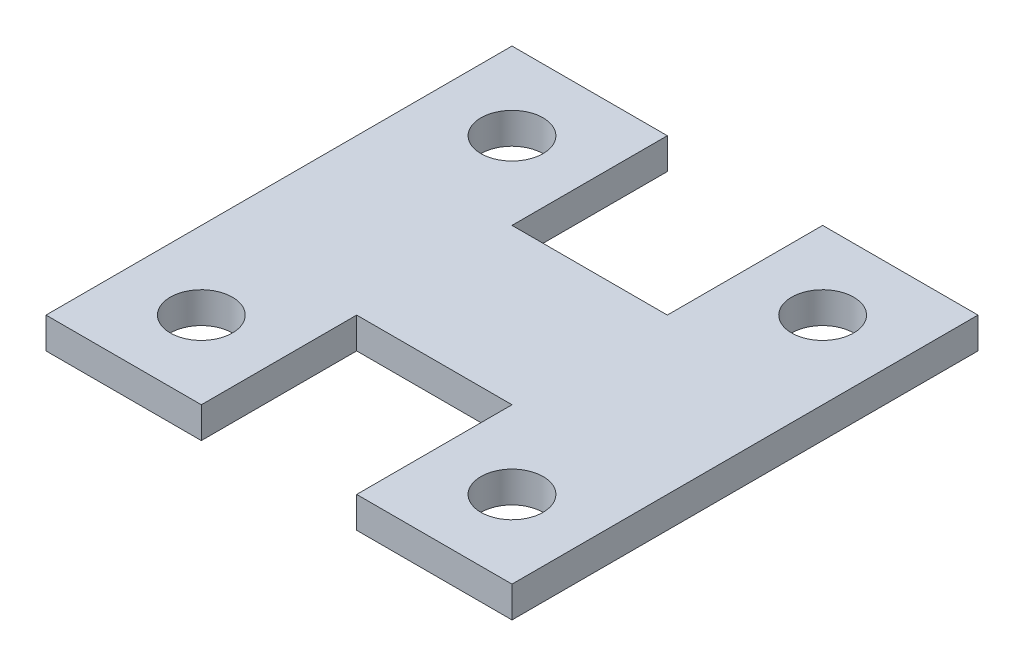
ISO-10303-21;
HEADER;
FILE_DESCRIPTION(('STEP AP214'),'2;1');
FILE_NAME('part.step','',(''),(''),'','','');
FILE_SCHEMA(('AUTOMOTIVE_DESIGN { 1 0 10303 214 1 1 1 1 }'));
ENDSEC;
DATA;
#1=APPLICATION_CONTEXT('core data for automotive mechanical design processes');
#2=APPLICATION_PROTOCOL_DEFINITION('international standard','automotive_design',2000,#1);
#3=PRODUCT_CONTEXT('',#1,'mechanical');
#4=PRODUCT('Part','Part','',(#3));
#5=PRODUCT_RELATED_PRODUCT_CATEGORY('part','',(#4));
#6=PRODUCT_DEFINITION_FORMATION('','',#4);
#7=PRODUCT_DEFINITION_CONTEXT('part definition',#1,'design');
#8=PRODUCT_DEFINITION('design','',#6,#7);
#9=PRODUCT_DEFINITION_SHAPE('','',#8);
#10=(LENGTH_UNIT() NAMED_UNIT(*) SI_UNIT(.MILLI.,.METRE.));
#11=(NAMED_UNIT(*) PLANE_ANGLE_UNIT() SI_UNIT($,.RADIAN.));
#12=(NAMED_UNIT(*) SI_UNIT($,.STERADIAN.) SOLID_ANGLE_UNIT());
#13=UNCERTAINTY_MEASURE_WITH_UNIT(LENGTH_MEASURE(1.E-05),#10,'distance_accuracy_value','');
#14=(GEOMETRIC_REPRESENTATION_CONTEXT(3) GLOBAL_UNCERTAINTY_ASSIGNED_CONTEXT((#13)) GLOBAL_UNIT_ASSIGNED_CONTEXT((#10,
#11,#12)) REPRESENTATION_CONTEXT('',''));
#15=CARTESIAN_POINT('',(0.,0.,0.));
#16=DIRECTION('',(0.,0.,1.));
#17=DIRECTION('',(1.,0.,0.));
#18=AXIS2_PLACEMENT_3D('',#15,#16,#17);
#19=CARTESIAN_POINT('',(0.,10.,0.));
#20=DIRECTION('',(0.,-1.,0.));
#21=DIRECTION('',(0.,0.,-1.));
#22=AXIS2_PLACEMENT_3D('',#19,#20,#21);
#23=PLANE('',#22);
#24=DIRECTION('',(1.,0.,0.));
#25=VECTOR('',#24,1.);
#26=CARTESIAN_POINT('',(25.,10.,75.));
#27=LINE('',#26,#25);
#28=CARTESIAN_POINT('',(25.,10.,75.));
#29=VERTEX_POINT('',#28);
#30=CARTESIAN_POINT('',(75.,10.,75.));
#31=VERTEX_POINT('',#30);
#32=EDGE_CURVE('E176',#29,#31,#27,.T.);
#33=ORIENTED_EDGE('',*,*,#32,.T.);
#34=DIRECTION('',(0.,0.,-1.));
#35=VECTOR('',#34,1.);
#36=CARTESIAN_POINT('',(75.,10.,-75.));
#37=LINE('',#36,#35);
#38=CARTESIAN_POINT('',(75.,10.,-75.));
#39=VERTEX_POINT('',#38);
#40=EDGE_CURVE('E104',#31,#39,#37,.T.);
#41=ORIENTED_EDGE('',*,*,#40,.T.);
#42=DIRECTION('',(-1.,0.,0.));
#43=VECTOR('',#42,1.);
#44=CARTESIAN_POINT('',(25.,10.,-75.));
#45=LINE('',#44,#43);
#46=CARTESIAN_POINT('',(25.,10.,-75.));
#47=VERTEX_POINT('',#46);
#48=EDGE_CURVE('E203',#39,#47,#45,.T.);
#49=ORIENTED_EDGE('',*,*,#48,.T.);
#50=DIRECTION('',(0.,0.,1.));
#51=VECTOR('',#50,1.);
#52=CARTESIAN_POINT('',(25.,10.,-75.));
#53=LINE('',#52,#51);
#54=CARTESIAN_POINT('',(25.,10.,-25.));
#55=VERTEX_POINT('',#54);
#56=EDGE_CURVE('E222',#47,#55,#53,.T.);
#57=ORIENTED_EDGE('',*,*,#56,.T.);
#58=DIRECTION('',(-1.,0.,0.));
#59=VECTOR('',#58,1.);
#60=CARTESIAN_POINT('',(-25.,10.,-25.));
#61=LINE('',#60,#59);
#62=CARTESIAN_POINT('',(-25.,10.,-25.));
#63=VERTEX_POINT('',#62);
#64=EDGE_CURVE('E219',#55,#63,#61,.T.);
#65=ORIENTED_EDGE('',*,*,#64,.T.);
#66=DIRECTION('',(0.,0.,-1.));
#67=VECTOR('',#66,1.);
#68=CARTESIAN_POINT('',(-25.,10.,-75.));
#69=LINE('',#68,#67);
#70=CARTESIAN_POINT('',(-25.,10.,-75.));
#71=VERTEX_POINT('',#70);
#72=EDGE_CURVE('E221',#63,#71,#69,.T.);
#73=ORIENTED_EDGE('',*,*,#72,.T.);
#74=DIRECTION('',(-1.,0.,0.));
#75=VECTOR('',#74,1.);
#76=CARTESIAN_POINT('',(-75.,10.,-75.));
#77=LINE('',#76,#75);
#78=CARTESIAN_POINT('',(-75.,10.,-75.));
#79=VERTEX_POINT('',#78);
#80=EDGE_CURVE('E224',#71,#79,#77,.T.);
#81=ORIENTED_EDGE('',*,*,#80,.T.);
#82=DIRECTION('',(0.,0.,1.));
#83=VECTOR('',#82,1.);
#84=CARTESIAN_POINT('',(-75.,10.,-75.));
#85=LINE('',#84,#83);
#86=CARTESIAN_POINT('',(-75.,10.,75.));
#87=VERTEX_POINT('',#86);
#88=EDGE_CURVE('E230',#79,#87,#85,.T.);
#89=ORIENTED_EDGE('',*,*,#88,.T.);
#90=DIRECTION('',(1.,0.,0.));
#91=VECTOR('',#90,1.);
#92=CARTESIAN_POINT('',(-75.,10.,75.));
#93=LINE('',#92,#91);
#94=CARTESIAN_POINT('',(-25.,10.,75.));
#95=VERTEX_POINT('',#94);
#96=EDGE_CURVE('E135',#87,#95,#93,.T.);
#97=ORIENTED_EDGE('',*,*,#96,.T.);
#98=DIRECTION('',(0.,0.,-1.));
#99=VECTOR('',#98,1.);
#100=CARTESIAN_POINT('',(-25.,10.,75.));
#101=LINE('',#100,#99);
#102=CARTESIAN_POINT('',(-25.,10.,25.));
#103=VERTEX_POINT('',#102);
#104=EDGE_CURVE('E129',#95,#103,#101,.T.);
#105=ORIENTED_EDGE('',*,*,#104,.T.);
#106=DIRECTION('',(1.,0.,0.));
#107=VECTOR('',#106,1.);
#108=CARTESIAN_POINT('',(-25.,10.,25.));
#109=LINE('',#108,#107);
#110=CARTESIAN_POINT('',(25.,10.,25.));
#111=VERTEX_POINT('',#110);
#112=EDGE_CURVE('E133',#103,#111,#109,.T.);
#113=ORIENTED_EDGE('',*,*,#112,.T.);
#114=DIRECTION('',(0.,0.,1.));
#115=VECTOR('',#114,1.);
#116=CARTESIAN_POINT('',(25.,10.,75.));
#117=LINE('',#116,#115);
#118=EDGE_CURVE('E49',#111,#29,#117,.T.);
#119=ORIENTED_EDGE('',*,*,#118,.T.);
#120=EDGE_LOOP('',(#33,#41,#49,#57,#65,#73,#81,#89,#97,#105,#113,#119));
#121=FACE_BOUND('',#120,.T.);
#122=CARTESIAN_POINT('',(-50.,10.,-50.));
#123=DIRECTION('',(0.,1.,0.));
#124=DIRECTION('',(0.,0.,1.));
#125=AXIS2_PLACEMENT_3D('',#122,#123,#124);
#126=CIRCLE('',#125,10.);
#127=CARTESIAN_POINT('',(-50.,10.,-40.));
#128=VERTEX_POINT('',#127);
#129=EDGE_CURVE('E157',#128,#128,#126,.T.);
#130=ORIENTED_EDGE('',*,*,#129,.F.);
#131=EDGE_LOOP('',(#130));
#132=FACE_BOUND('',#131,.T.);
#133=CARTESIAN_POINT('',(50.,10.,-50.));
#134=DIRECTION('',(0.,1.,0.));
#135=DIRECTION('',(0.,0.,-1.));
#136=AXIS2_PLACEMENT_3D('',#133,#134,#135);
#137=CIRCLE('',#136,10.);
#138=CARTESIAN_POINT('',(50.,10.,-60.));
#139=VERTEX_POINT('',#138);
#140=EDGE_CURVE('E294',#139,#139,#137,.T.);
#141=ORIENTED_EDGE('',*,*,#140,.F.);
#142=EDGE_LOOP('',(#141));
#143=FACE_BOUND('',#142,.T.);
#144=CARTESIAN_POINT('',(50.,10.,50.));
#145=DIRECTION('',(0.,1.,0.));
#146=DIRECTION('',(0.,0.,1.));
#147=AXIS2_PLACEMENT_3D('',#144,#145,#146);
#148=CIRCLE('',#147,10.);
#149=CARTESIAN_POINT('',(50.,10.,60.));
#150=VERTEX_POINT('',#149);
#151=EDGE_CURVE('E288',#150,#150,#148,.T.);
#152=ORIENTED_EDGE('',*,*,#151,.F.);
#153=EDGE_LOOP('',(#152));
#154=FACE_BOUND('',#153,.T.);
#155=CARTESIAN_POINT('',(-50.,10.,50.));
#156=DIRECTION('',(0.,1.,0.));
#157=DIRECTION('',(0.,0.,-1.));
#158=AXIS2_PLACEMENT_3D('',#155,#156,#157);
#159=CIRCLE('',#158,10.);
#160=CARTESIAN_POINT('',(-50.,10.,40.));
#161=VERTEX_POINT('',#160);
#162=EDGE_CURVE('E279',#161,#161,#159,.T.);
#163=ORIENTED_EDGE('',*,*,#162,.F.);
#164=EDGE_LOOP('',(#163));
#165=FACE_BOUND('',#164,.T.);
#166=ADVANCED_FACE('F32',(#121,#132,#143,#154,#165),#23,.F.);
#167=CARTESIAN_POINT('',(0.,0.,0.));
#168=DIRECTION('',(0.,-1.,0.));
#169=DIRECTION('',(0.,0.,-1.));
#170=AXIS2_PLACEMENT_3D('',#167,#168,#169);
#171=PLANE('',#170);
#172=CARTESIAN_POINT('',(50.,0.,50.));
#173=DIRECTION('',(0.,1.,0.));
#174=DIRECTION('',(0.,0.,1.));
#175=AXIS2_PLACEMENT_3D('',#172,#173,#174);
#176=CIRCLE('',#175,10.);
#177=CARTESIAN_POINT('',(50.,0.,60.));
#178=VERTEX_POINT('',#177);
#179=EDGE_CURVE('E285',#178,#178,#176,.T.);
#180=ORIENTED_EDGE('',*,*,#179,.T.);
#181=EDGE_LOOP('',(#180));
#182=FACE_BOUND('',#181,.T.);
#183=CARTESIAN_POINT('',(-50.,0.,-50.));
#184=DIRECTION('',(0.,1.,0.));
#185=DIRECTION('',(0.,0.,1.));
#186=AXIS2_PLACEMENT_3D('',#183,#184,#185);
#187=CIRCLE('',#186,10.);
#188=CARTESIAN_POINT('',(-50.,0.,-40.));
#189=VERTEX_POINT('',#188);
#190=EDGE_CURVE('E297',#189,#189,#187,.T.);
#191=ORIENTED_EDGE('',*,*,#190,.T.);
#192=EDGE_LOOP('',(#191));
#193=FACE_BOUND('',#192,.T.);
#194=DIRECTION('',(1.,0.,0.));
#195=VECTOR('',#194,1.);
#196=CARTESIAN_POINT('',(25.,0.,75.));
#197=LINE('',#196,#195);
#198=CARTESIAN_POINT('',(25.,0.,75.));
#199=VERTEX_POINT('',#198);
#200=CARTESIAN_POINT('',(75.,0.,75.));
#201=VERTEX_POINT('',#200);
#202=EDGE_CURVE('E153',#199,#201,#197,.T.);
#203=ORIENTED_EDGE('',*,*,#202,.F.);
#204=DIRECTION('',(0.,0.,1.));
#205=VECTOR('',#204,1.);
#206=CARTESIAN_POINT('',(25.,0.,75.));
#207=LINE('',#206,#205);
#208=CARTESIAN_POINT('',(25.,0.,25.));
#209=VERTEX_POINT('',#208);
#210=EDGE_CURVE('E96',#209,#199,#207,.T.);
#211=ORIENTED_EDGE('',*,*,#210,.F.);
#212=DIRECTION('',(1.,0.,0.));
#213=VECTOR('',#212,1.);
#214=CARTESIAN_POINT('',(-25.,0.,25.));
#215=LINE('',#214,#213);
#216=CARTESIAN_POINT('',(-25.,0.,25.));
#217=VERTEX_POINT('',#216);
#218=EDGE_CURVE('E90',#217,#209,#215,.T.);
#219=ORIENTED_EDGE('',*,*,#218,.F.);
#220=DIRECTION('',(0.,0.,-1.));
#221=VECTOR('',#220,1.);
#222=CARTESIAN_POINT('',(-25.,0.,75.));
#223=LINE('',#222,#221);
#224=CARTESIAN_POINT('',(-25.,0.,75.));
#225=VERTEX_POINT('',#224);
#226=EDGE_CURVE('E143',#225,#217,#223,.T.);
#227=ORIENTED_EDGE('',*,*,#226,.F.);
#228=DIRECTION('',(1.,0.,0.));
#229=VECTOR('',#228,1.);
#230=CARTESIAN_POINT('',(-75.,0.,75.));
#231=LINE('',#230,#229);
#232=CARTESIAN_POINT('',(-75.,0.,75.));
#233=VERTEX_POINT('',#232);
#234=EDGE_CURVE('E171',#233,#225,#231,.T.);
#235=ORIENTED_EDGE('',*,*,#234,.F.);
#236=DIRECTION('',(0.,0.,1.));
#237=VECTOR('',#236,1.);
#238=CARTESIAN_POINT('',(-75.,0.,-75.));
#239=LINE('',#238,#237);
#240=CARTESIAN_POINT('',(-75.,0.,-75.));
#241=VERTEX_POINT('',#240);
#242=EDGE_CURVE('E169',#241,#233,#239,.T.);
#243=ORIENTED_EDGE('',*,*,#242,.F.);
#244=DIRECTION('',(-1.,0.,0.));
#245=VECTOR('',#244,1.);
#246=CARTESIAN_POINT('',(-75.,0.,-75.));
#247=LINE('',#246,#245);
#248=CARTESIAN_POINT('',(-25.,0.,-75.));
#249=VERTEX_POINT('',#248);
#250=EDGE_CURVE('E167',#249,#241,#247,.T.);
#251=ORIENTED_EDGE('',*,*,#250,.F.);
#252=DIRECTION('',(0.,0.,-1.));
#253=VECTOR('',#252,1.);
#254=CARTESIAN_POINT('',(-25.,0.,-75.));
#255=LINE('',#254,#253);
#256=CARTESIAN_POINT('',(-25.,0.,-25.));
#257=VERTEX_POINT('',#256);
#258=EDGE_CURVE('E165',#257,#249,#255,.T.);
#259=ORIENTED_EDGE('',*,*,#258,.F.);
#260=DIRECTION('',(-1.,0.,0.));
#261=VECTOR('',#260,1.);
#262=CARTESIAN_POINT('',(-25.,0.,-25.));
#263=LINE('',#262,#261);
#264=CARTESIAN_POINT('',(25.,0.,-25.));
#265=VERTEX_POINT('',#264);
#266=EDGE_CURVE('E163',#265,#257,#263,.T.);
#267=ORIENTED_EDGE('',*,*,#266,.F.);
#268=DIRECTION('',(0.,0.,1.));
#269=VECTOR('',#268,1.);
#270=CARTESIAN_POINT('',(25.,0.,-75.));
#271=LINE('',#270,#269);
#272=CARTESIAN_POINT('',(25.,0.,-75.));
#273=VERTEX_POINT('',#272);
#274=EDGE_CURVE('E161',#273,#265,#271,.T.);
#275=ORIENTED_EDGE('',*,*,#274,.F.);
#276=DIRECTION('',(-1.,0.,0.));
#277=VECTOR('',#276,1.);
#278=CARTESIAN_POINT('',(25.,0.,-75.));
#279=LINE('',#278,#277);
#280=CARTESIAN_POINT('',(75.,0.,-75.));
#281=VERTEX_POINT('',#280);
#282=EDGE_CURVE('E159',#281,#273,#279,.T.);
#283=ORIENTED_EDGE('',*,*,#282,.F.);
#284=DIRECTION('',(0.,0.,-1.));
#285=VECTOR('',#284,1.);
#286=CARTESIAN_POINT('',(75.,0.,-75.));
#287=LINE('',#286,#285);
#288=EDGE_CURVE('E156',#201,#281,#287,.T.);
#289=ORIENTED_EDGE('',*,*,#288,.F.);
#290=EDGE_LOOP('',(#203,#211,#219,#227,#235,#243,#251,#259,#267,#275,#283,#289));
#291=FACE_BOUND('',#290,.T.);
#292=CARTESIAN_POINT('',(50.,0.,-50.));
#293=DIRECTION('',(0.,1.,0.));
#294=DIRECTION('',(0.,0.,-1.));
#295=AXIS2_PLACEMENT_3D('',#292,#293,#294);
#296=CIRCLE('',#295,10.);
#297=CARTESIAN_POINT('',(50.,0.,-60.));
#298=VERTEX_POINT('',#297);
#299=EDGE_CURVE('E291',#298,#298,#296,.T.);
#300=ORIENTED_EDGE('',*,*,#299,.T.);
#301=EDGE_LOOP('',(#300));
#302=FACE_BOUND('',#301,.T.);
#303=CARTESIAN_POINT('',(-50.,0.,50.));
#304=DIRECTION('',(0.,1.,0.));
#305=DIRECTION('',(0.,0.,-1.));
#306=AXIS2_PLACEMENT_3D('',#303,#304,#305);
#307=CIRCLE('',#306,10.);
#308=CARTESIAN_POINT('',(-50.,0.,40.));
#309=VERTEX_POINT('',#308);
#310=EDGE_CURVE('E282',#309,#309,#307,.T.);
#311=ORIENTED_EDGE('',*,*,#310,.T.);
#312=EDGE_LOOP('',(#311));
#313=FACE_BOUND('',#312,.T.);
#314=ADVANCED_FACE('F207',(#182,#193,#291,#302,#313),#171,.T.);
#315=CARTESIAN_POINT('',(25.,10.,75.));
#316=DIRECTION('',(0.,0.,-1.));
#317=DIRECTION('',(-1.,0.,0.));
#318=AXIS2_PLACEMENT_3D('',#315,#316,#317);
#319=PLANE('',#318);
#320=ORIENTED_EDGE('',*,*,#202,.T.);
#321=DIRECTION('',(0.,-1.,0.));
#322=VECTOR('',#321,1.);
#323=CARTESIAN_POINT('',(75.,10.,75.));
#324=LINE('',#323,#322);
#325=EDGE_CURVE('E11',#31,#201,#324,.T.);
#326=ORIENTED_EDGE('',*,*,#325,.F.);
#327=ORIENTED_EDGE('',*,*,#32,.F.);
#328=DIRECTION('',(0.,-1.,0.));
#329=VECTOR('',#328,1.);
#330=CARTESIAN_POINT('',(25.,10.,75.));
#331=LINE('',#330,#329);
#332=EDGE_CURVE('E149',#29,#199,#331,.T.);
#333=ORIENTED_EDGE('',*,*,#332,.T.);
#334=EDGE_LOOP('',(#320,#326,#327,#333));
#335=FACE_BOUND('',#334,.T.);
#336=ADVANCED_FACE('F34',(#335),#319,.F.);
#337=CARTESIAN_POINT('',(75.,10.,-75.));
#338=DIRECTION('',(-1.,0.,0.));
#339=DIRECTION('',(0.,0.,1.));
#340=AXIS2_PLACEMENT_3D('',#337,#338,#339);
#341=PLANE('',#340);
#342=ORIENTED_EDGE('',*,*,#288,.T.);
#343=DIRECTION('',(0.,-1.,0.));
#344=VECTOR('',#343,1.);
#345=CARTESIAN_POINT('',(75.,10.,-75.));
#346=LINE('',#345,#344);
#347=EDGE_CURVE('E41',#39,#281,#346,.T.);
#348=ORIENTED_EDGE('',*,*,#347,.F.);
#349=ORIENTED_EDGE('',*,*,#40,.F.);
#350=ORIENTED_EDGE('',*,*,#325,.T.);
#351=EDGE_LOOP('',(#342,#348,#349,#350));
#352=FACE_BOUND('',#351,.T.);
#353=ADVANCED_FACE('F409',(#352),#341,.F.);
#354=CARTESIAN_POINT('',(25.,10.,-75.));
#355=DIRECTION('',(0.,0.,1.));
#356=DIRECTION('',(1.,0.,0.));
#357=AXIS2_PLACEMENT_3D('',#354,#355,#356);
#358=PLANE('',#357);
#359=ORIENTED_EDGE('',*,*,#282,.T.);
#360=DIRECTION('',(0.,-1.,0.));
#361=VECTOR('',#360,1.);
#362=CARTESIAN_POINT('',(25.,10.,-75.));
#363=LINE('',#362,#361);
#364=EDGE_CURVE('E195',#47,#273,#363,.T.);
#365=ORIENTED_EDGE('',*,*,#364,.F.);
#366=ORIENTED_EDGE('',*,*,#48,.F.);
#367=ORIENTED_EDGE('',*,*,#347,.T.);
#368=EDGE_LOOP('',(#359,#365,#366,#367));
#369=FACE_BOUND('',#368,.T.);
#370=ADVANCED_FACE('F201',(#369),#358,.F.);
#371=CARTESIAN_POINT('',(25.,10.,-75.));
#372=DIRECTION('',(1.,0.,0.));
#373=DIRECTION('',(0.,0.,-1.));
#374=AXIS2_PLACEMENT_3D('',#371,#372,#373);
#375=PLANE('',#374);
#376=ORIENTED_EDGE('',*,*,#274,.T.);
#377=DIRECTION('',(0.,-1.,0.));
#378=VECTOR('',#377,1.);
#379=CARTESIAN_POINT('',(25.,10.,-25.));
#380=LINE('',#379,#378);
#381=EDGE_CURVE('E192',#55,#265,#380,.T.);
#382=ORIENTED_EDGE('',*,*,#381,.F.);
#383=ORIENTED_EDGE('',*,*,#56,.F.);
#384=ORIENTED_EDGE('',*,*,#364,.T.);
#385=EDGE_LOOP('',(#376,#382,#383,#384));
#386=FACE_BOUND('',#385,.T.);
#387=ADVANCED_FACE('F213',(#386),#375,.F.);
#388=CARTESIAN_POINT('',(-25.,10.,-25.));
#389=DIRECTION('',(0.,0.,1.));
#390=DIRECTION('',(1.,0.,0.));
#391=AXIS2_PLACEMENT_3D('',#388,#389,#390);
#392=PLANE('',#391);
#393=ORIENTED_EDGE('',*,*,#266,.T.);
#394=DIRECTION('',(0.,-1.,0.));
#395=VECTOR('',#394,1.);
#396=CARTESIAN_POINT('',(-25.,10.,-25.));
#397=LINE('',#396,#395);
#398=EDGE_CURVE('E189',#63,#257,#397,.T.);
#399=ORIENTED_EDGE('',*,*,#398,.F.);
#400=ORIENTED_EDGE('',*,*,#64,.F.);
#401=ORIENTED_EDGE('',*,*,#381,.T.);
#402=EDGE_LOOP('',(#393,#399,#400,#401));
#403=FACE_BOUND('',#402,.T.);
#404=ADVANCED_FACE('F217',(#403),#392,.F.);
#405=CARTESIAN_POINT('',(-25.,10.,-75.));
#406=DIRECTION('',(-1.,0.,0.));
#407=DIRECTION('',(0.,0.,1.));
#408=AXIS2_PLACEMENT_3D('',#405,#406,#407);
#409=PLANE('',#408);
#410=ORIENTED_EDGE('',*,*,#258,.T.);
#411=DIRECTION('',(0.,-1.,0.));
#412=VECTOR('',#411,1.);
#413=CARTESIAN_POINT('',(-25.,10.,-75.));
#414=LINE('',#413,#412);
#415=EDGE_CURVE('E186',#71,#249,#414,.T.);
#416=ORIENTED_EDGE('',*,*,#415,.F.);
#417=ORIENTED_EDGE('',*,*,#72,.F.);
#418=ORIENTED_EDGE('',*,*,#398,.T.);
#419=EDGE_LOOP('',(#410,#416,#417,#418));
#420=FACE_BOUND('',#419,.T.);
#421=ADVANCED_FACE('F374',(#420),#409,.F.);
#422=CARTESIAN_POINT('',(-75.,10.,-75.));
#423=DIRECTION('',(0.,0.,1.));
#424=DIRECTION('',(1.,0.,0.));
#425=AXIS2_PLACEMENT_3D('',#422,#423,#424);
#426=PLANE('',#425);
#427=ORIENTED_EDGE('',*,*,#250,.T.);
#428=DIRECTION('',(0.,-1.,0.));
#429=VECTOR('',#428,1.);
#430=CARTESIAN_POINT('',(-75.,10.,-75.));
#431=LINE('',#430,#429);
#432=EDGE_CURVE('E183',#79,#241,#431,.T.);
#433=ORIENTED_EDGE('',*,*,#432,.F.);
#434=ORIENTED_EDGE('',*,*,#80,.F.);
#435=ORIENTED_EDGE('',*,*,#415,.T.);
#436=EDGE_LOOP('',(#427,#433,#434,#435));
#437=FACE_BOUND('',#436,.T.);
#438=ADVANCED_FACE('F365',(#437),#426,.F.);
#439=CARTESIAN_POINT('',(-75.,10.,-75.));
#440=DIRECTION('',(1.,0.,0.));
#441=DIRECTION('',(0.,0.,-1.));
#442=AXIS2_PLACEMENT_3D('',#439,#440,#441);
#443=PLANE('',#442);
#444=ORIENTED_EDGE('',*,*,#242,.T.);
#445=DIRECTION('',(0.,-1.,0.));
#446=VECTOR('',#445,1.);
#447=CARTESIAN_POINT('',(-75.,10.,75.));
#448=LINE('',#447,#446);
#449=EDGE_CURVE('E180',#87,#233,#448,.T.);
#450=ORIENTED_EDGE('',*,*,#449,.F.);
#451=ORIENTED_EDGE('',*,*,#88,.F.);
#452=ORIENTED_EDGE('',*,*,#432,.T.);
#453=EDGE_LOOP('',(#444,#450,#451,#452));
#454=FACE_BOUND('',#453,.T.);
#455=ADVANCED_FACE('F236',(#454),#443,.F.);
#456=CARTESIAN_POINT('',(-75.,10.,75.));
#457=DIRECTION('',(0.,0.,-1.));
#458=DIRECTION('',(-1.,0.,0.));
#459=AXIS2_PLACEMENT_3D('',#456,#457,#458);
#460=PLANE('',#459);
#461=ORIENTED_EDGE('',*,*,#234,.T.);
#462=DIRECTION('',(0.,-1.,0.));
#463=VECTOR('',#462,1.);
#464=CARTESIAN_POINT('',(-25.,10.,75.));
#465=LINE('',#464,#463);
#466=EDGE_CURVE('E144',#95,#225,#465,.T.);
#467=ORIENTED_EDGE('',*,*,#466,.F.);
#468=ORIENTED_EDGE('',*,*,#96,.F.);
#469=ORIENTED_EDGE('',*,*,#449,.T.);
#470=EDGE_LOOP('',(#461,#467,#468,#469));
#471=FACE_BOUND('',#470,.T.);
#472=ADVANCED_FACE('F240',(#471),#460,.F.);
#473=CARTESIAN_POINT('',(-25.,10.,75.));
#474=DIRECTION('',(-1.,0.,0.));
#475=DIRECTION('',(0.,0.,1.));
#476=AXIS2_PLACEMENT_3D('',#473,#474,#475);
#477=PLANE('',#476);
#478=ORIENTED_EDGE('',*,*,#226,.T.);
#479=DIRECTION('',(0.,-1.,0.));
#480=VECTOR('',#479,1.);
#481=CARTESIAN_POINT('',(-25.,10.,25.));
#482=LINE('',#481,#480);
#483=EDGE_CURVE('E140',#103,#217,#482,.T.);
#484=ORIENTED_EDGE('',*,*,#483,.F.);
#485=ORIENTED_EDGE('',*,*,#104,.F.);
#486=ORIENTED_EDGE('',*,*,#466,.T.);
#487=EDGE_LOOP('',(#478,#484,#485,#486));
#488=FACE_BOUND('',#487,.T.);
#489=ADVANCED_FACE('F141',(#488),#477,.F.);
#490=CARTESIAN_POINT('',(-25.,10.,25.));
#491=DIRECTION('',(0.,0.,-1.));
#492=DIRECTION('',(-1.,0.,0.));
#493=AXIS2_PLACEMENT_3D('',#490,#491,#492);
#494=PLANE('',#493);
#495=ORIENTED_EDGE('',*,*,#218,.T.);
#496=DIRECTION('',(0.,-1.,0.));
#497=VECTOR('',#496,1.);
#498=CARTESIAN_POINT('',(25.,10.,25.));
#499=LINE('',#498,#497);
#500=EDGE_CURVE('E145',#111,#209,#499,.T.);
#501=ORIENTED_EDGE('',*,*,#500,.F.);
#502=ORIENTED_EDGE('',*,*,#112,.F.);
#503=ORIENTED_EDGE('',*,*,#483,.T.);
#504=EDGE_LOOP('',(#495,#501,#502,#503));
#505=FACE_BOUND('',#504,.T.);
#506=ADVANCED_FACE('F147',(#505),#494,.F.);
#507=CARTESIAN_POINT('',(25.,10.,75.));
#508=DIRECTION('',(1.,0.,0.));
#509=DIRECTION('',(0.,0.,-1.));
#510=AXIS2_PLACEMENT_3D('',#507,#508,#509);
#511=PLANE('',#510);
#512=ORIENTED_EDGE('',*,*,#210,.T.);
#513=ORIENTED_EDGE('',*,*,#332,.F.);
#514=ORIENTED_EDGE('',*,*,#118,.F.);
#515=ORIENTED_EDGE('',*,*,#500,.T.);
#516=EDGE_LOOP('',(#512,#513,#514,#515));
#517=FACE_BOUND('',#516,.T.);
#518=ADVANCED_FACE('F244',(#517),#511,.F.);
#519=CARTESIAN_POINT('',(-50.,10.,-50.));
#520=DIRECTION('',(0.,-1.,0.));
#521=DIRECTION('',(0.,0.,-1.));
#522=AXIS2_PLACEMENT_3D('',#519,#520,#521);
#523=CYLINDRICAL_SURFACE('',#522,10.);
#524=ORIENTED_EDGE('',*,*,#129,.T.);
#525=EDGE_LOOP('',(#524));
#526=FACE_BOUND('',#525,.T.);
#527=ORIENTED_EDGE('',*,*,#190,.F.);
#528=EDGE_LOOP('',(#527));
#529=FACE_BOUND('',#528,.T.);
#530=ADVANCED_FACE('F246',(#526,#529),#523,.F.);
#531=CARTESIAN_POINT('',(50.,10.,-50.));
#532=DIRECTION('',(0.,-1.,0.));
#533=DIRECTION('',(0.,0.,-1.));
#534=AXIS2_PLACEMENT_3D('',#531,#532,#533);
#535=CYLINDRICAL_SURFACE('',#534,10.);
#536=ORIENTED_EDGE('',*,*,#140,.T.);
#537=EDGE_LOOP('',(#536));
#538=FACE_BOUND('',#537,.T.);
#539=ORIENTED_EDGE('',*,*,#299,.F.);
#540=EDGE_LOOP('',(#539));
#541=FACE_BOUND('',#540,.T.);
#542=ADVANCED_FACE('F252',(#538,#541),#535,.F.);
#543=CARTESIAN_POINT('',(50.,10.,50.));
#544=DIRECTION('',(0.,-1.,0.));
#545=DIRECTION('',(0.,0.,-1.));
#546=AXIS2_PLACEMENT_3D('',#543,#544,#545);
#547=CYLINDRICAL_SURFACE('',#546,10.);
#548=ORIENTED_EDGE('',*,*,#151,.T.);
#549=EDGE_LOOP('',(#548));
#550=FACE_BOUND('',#549,.T.);
#551=ORIENTED_EDGE('',*,*,#179,.F.);
#552=EDGE_LOOP('',(#551));
#553=FACE_BOUND('',#552,.T.);
#554=ADVANCED_FACE('F266',(#550,#553),#547,.F.);
#555=CARTESIAN_POINT('',(-50.,10.,50.));
#556=DIRECTION('',(0.,-1.,0.));
#557=DIRECTION('',(0.,0.,-1.));
#558=AXIS2_PLACEMENT_3D('',#555,#556,#557);
#559=CYLINDRICAL_SURFACE('',#558,10.);
#560=ORIENTED_EDGE('',*,*,#162,.T.);
#561=EDGE_LOOP('',(#560));
#562=FACE_BOUND('',#561,.T.);
#563=ORIENTED_EDGE('',*,*,#310,.F.);
#564=EDGE_LOOP('',(#563));
#565=FACE_BOUND('',#564,.T.);
#566=ADVANCED_FACE('F270',(#562,#565),#559,.F.);
#567=CLOSED_SHELL('',(#166,#314,#336,#353,#370,#387,#404,#421,#438,#455,#472,#489,#506,#518,
#530,#542,#554,#566));
#568=MANIFOLD_SOLID_BREP('B2',#567);
#569=ADVANCED_BREP_SHAPE_REPRESENTATION('',(#18,#568),#14);
#570=SHAPE_DEFINITION_REPRESENTATION(#9,#569);
ENDSEC;
END-ISO-10303-21;
